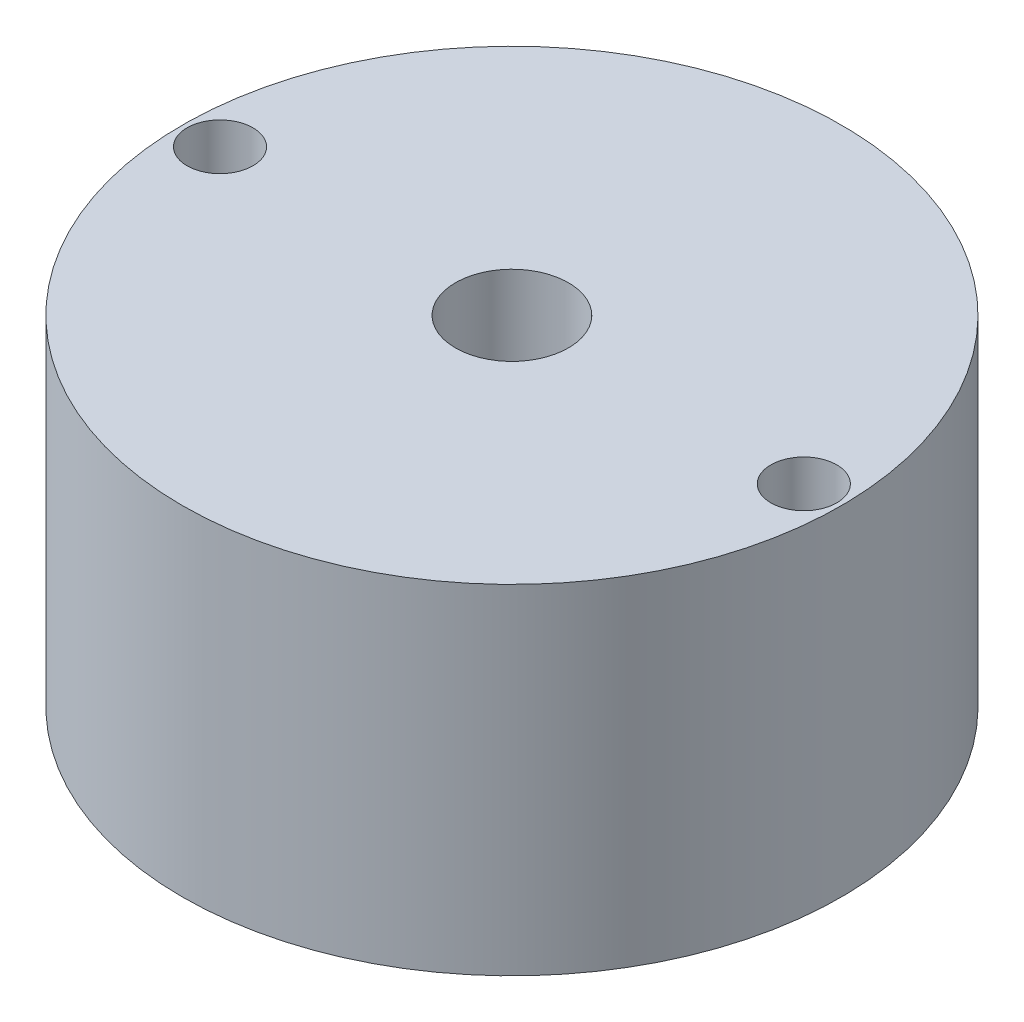
ISO-10303-21;
HEADER;
FILE_DESCRIPTION(('STEP AP214'),'2;1');
FILE_NAME('part.step','',(''),(''),'','','');
FILE_SCHEMA(('AUTOMOTIVE_DESIGN { 1 0 10303 214 1 1 1 1 }'));
ENDSEC;
DATA;
#1=APPLICATION_CONTEXT('core data for automotive mechanical design processes');
#2=APPLICATION_PROTOCOL_DEFINITION('international standard','automotive_design',2000,#1);
#3=PRODUCT_CONTEXT('',#1,'mechanical');
#4=PRODUCT('Part','Part','',(#3));
#5=PRODUCT_RELATED_PRODUCT_CATEGORY('part','',(#4));
#6=PRODUCT_DEFINITION_FORMATION('','',#4);
#7=PRODUCT_DEFINITION_CONTEXT('part definition',#1,'design');
#8=PRODUCT_DEFINITION('design','',#6,#7);
#9=PRODUCT_DEFINITION_SHAPE('','',#8);
#10=(LENGTH_UNIT() NAMED_UNIT(*) SI_UNIT(.MILLI.,.METRE.));
#11=(NAMED_UNIT(*) PLANE_ANGLE_UNIT() SI_UNIT($,.RADIAN.));
#12=(NAMED_UNIT(*) SI_UNIT($,.STERADIAN.) SOLID_ANGLE_UNIT());
#13=UNCERTAINTY_MEASURE_WITH_UNIT(LENGTH_MEASURE(1.E-05),#10,'distance_accuracy_value','');
#14=(GEOMETRIC_REPRESENTATION_CONTEXT(3) GLOBAL_UNCERTAINTY_ASSIGNED_CONTEXT((#13)) GLOBAL_UNIT_ASSIGNED_CONTEXT((#10,
#11,#12)) REPRESENTATION_CONTEXT('',''));
#15=CARTESIAN_POINT('',(0.,0.,0.));
#16=DIRECTION('',(0.,0.,1.));
#17=DIRECTION('',(1.,0.,0.));
#18=AXIS2_PLACEMENT_3D('',#15,#16,#17);
#19=CARTESIAN_POINT('',(0.,18.,0.));
#20=DIRECTION('',(0.,-1.,0.));
#21=DIRECTION('',(0.,0.,-1.));
#22=AXIS2_PLACEMENT_3D('',#19,#20,#21);
#23=CYLINDRICAL_SURFACE('',#22,17.5);
#24=CARTESIAN_POINT('',(0.,18.,0.));
#25=DIRECTION('',(0.,1.,0.));
#26=DIRECTION('',(0.,0.,1.));
#27=AXIS2_PLACEMENT_3D('',#24,#25,#26);
#28=CIRCLE('',#27,17.5);
#29=CARTESIAN_POINT('',(0.,18.,17.5));
#30=VERTEX_POINT('',#29);
#31=EDGE_CURVE('E10',#30,#30,#28,.T.);
#32=ORIENTED_EDGE('',*,*,#31,.F.);
#33=EDGE_LOOP('',(#32));
#34=FACE_BOUND('',#33,.T.);
#35=CARTESIAN_POINT('',(0.,0.,0.));
#36=DIRECTION('',(0.,1.,0.));
#37=DIRECTION('',(0.,0.,1.));
#38=AXIS2_PLACEMENT_3D('',#35,#36,#37);
#39=CIRCLE('',#38,17.5);
#40=CARTESIAN_POINT('',(0.,0.,17.5));
#41=VERTEX_POINT('',#40);
#42=EDGE_CURVE('E46',#41,#41,#39,.T.);
#43=ORIENTED_EDGE('',*,*,#42,.T.);
#44=EDGE_LOOP('',(#43));
#45=FACE_BOUND('',#44,.T.);
#46=ADVANCED_FACE('F43',(#34,#45),#23,.T.);
#47=CARTESIAN_POINT('',(0.,18.,0.));
#48=DIRECTION('',(0.,1.,0.));
#49=DIRECTION('',(0.,0.,1.));
#50=AXIS2_PLACEMENT_3D('',#47,#48,#49);
#51=PLANE('',#50);
#52=CARTESIAN_POINT('',(15.5,18.,0.));
#53=DIRECTION('',(0.,1.,0.));
#54=DIRECTION('',(0.,0.,1.));
#55=AXIS2_PLACEMENT_3D('',#52,#53,#54);
#56=CIRCLE('',#55,1.75);
#57=CARTESIAN_POINT('',(15.5,18.,1.75));
#58=VERTEX_POINT('',#57);
#59=EDGE_CURVE('E73',#58,#58,#56,.T.);
#60=ORIENTED_EDGE('',*,*,#59,.F.);
#61=EDGE_LOOP('',(#60));
#62=FACE_BOUND('',#61,.T.);
#63=CARTESIAN_POINT('',(-15.5,18.,0.));
#64=DIRECTION('',(0.,1.,0.));
#65=DIRECTION('',(0.,0.,1.));
#66=AXIS2_PLACEMENT_3D('',#63,#64,#65);
#67=CIRCLE('',#66,1.75);
#68=CARTESIAN_POINT('',(-15.5,18.,1.75));
#69=VERTEX_POINT('',#68);
#70=EDGE_CURVE('E69',#69,#69,#67,.T.);
#71=ORIENTED_EDGE('',*,*,#70,.F.);
#72=EDGE_LOOP('',(#71));
#73=FACE_BOUND('',#72,.T.);
#74=CARTESIAN_POINT('',(0.,18.,0.));
#75=DIRECTION('',(0.,1.,0.));
#76=DIRECTION('',(0.,0.,1.));
#77=AXIS2_PLACEMENT_3D('',#74,#75,#76);
#78=CIRCLE('',#77,3.);
#79=CARTESIAN_POINT('',(0.,18.,3.));
#80=VERTEX_POINT('',#79);
#81=EDGE_CURVE('E57',#80,#80,#78,.T.);
#82=ORIENTED_EDGE('',*,*,#81,.F.);
#83=EDGE_LOOP('',(#82));
#84=FACE_BOUND('',#83,.T.);
#85=ORIENTED_EDGE('',*,*,#31,.T.);
#86=EDGE_LOOP('',(#85));
#87=FACE_BOUND('',#86,.T.);
#88=ADVANCED_FACE('F90',(#62,#73,#84,#87),#51,.T.);
#89=CARTESIAN_POINT('',(0.,0.,0.));
#90=DIRECTION('',(0.,1.,0.));
#91=DIRECTION('',(0.,0.,1.));
#92=AXIS2_PLACEMENT_3D('',#89,#90,#91);
#93=PLANE('',#92);
#94=ORIENTED_EDGE('',*,*,#42,.F.);
#95=EDGE_LOOP('',(#94));
#96=FACE_BOUND('',#95,.T.);
#97=ADVANCED_FACE('F93',(#96),#93,.F.);
#98=CARTESIAN_POINT('',(0.,6.00000000000001,0.));
#99=DIRECTION('',(0.,1.,0.));
#100=DIRECTION('',(0.,0.,1.));
#101=AXIS2_PLACEMENT_3D('',#98,#99,#100);
#102=CYLINDRICAL_SURFACE('',#101,3.);
#103=CARTESIAN_POINT('',(0.,6.00000000000001,0.));
#104=DIRECTION('',(0.,1.,0.));
#105=DIRECTION('',(0.,0.,1.));
#106=AXIS2_PLACEMENT_3D('',#103,#104,#105);
#107=CIRCLE('',#106,3.);
#108=CARTESIAN_POINT('',(0.,6.00000000000001,3.));
#109=VERTEX_POINT('',#108);
#110=EDGE_CURVE('E55',#109,#109,#107,.T.);
#111=ORIENTED_EDGE('',*,*,#110,.F.);
#112=EDGE_LOOP('',(#111));
#113=FACE_BOUND('',#112,.T.);
#114=ORIENTED_EDGE('',*,*,#81,.T.);
#115=EDGE_LOOP('',(#114));
#116=FACE_BOUND('',#115,.T.);
#117=ADVANCED_FACE('F99',(#113,#116),#102,.F.);
#118=CARTESIAN_POINT('',(0.,6.00000000000001,0.));
#119=DIRECTION('',(0.,1.,0.));
#120=DIRECTION('',(0.,0.,1.));
#121=AXIS2_PLACEMENT_3D('',#118,#119,#120);
#122=PLANE('',#121);
#123=ORIENTED_EDGE('',*,*,#110,.T.);
#124=EDGE_LOOP('',(#123));
#125=FACE_BOUND('',#124,.T.);
#126=ADVANCED_FACE('F101',(#125),#122,.T.);
#127=CARTESIAN_POINT('',(-15.5,10.,0.));
#128=DIRECTION('',(0.,1.,0.));
#129=DIRECTION('',(0.,0.,1.));
#130=AXIS2_PLACEMENT_3D('',#127,#128,#129);
#131=CYLINDRICAL_SURFACE('',#130,1.75);
#132=CARTESIAN_POINT('',(-15.5,10.,0.));
#133=DIRECTION('',(0.,1.,0.));
#134=DIRECTION('',(0.,0.,1.));
#135=AXIS2_PLACEMENT_3D('',#132,#133,#134);
#136=CIRCLE('',#135,1.75);
#137=CARTESIAN_POINT('',(-15.5,10.,1.75));
#138=VERTEX_POINT('',#137);
#139=EDGE_CURVE('E65',#138,#138,#136,.T.);
#140=ORIENTED_EDGE('',*,*,#139,.F.);
#141=EDGE_LOOP('',(#140));
#142=FACE_BOUND('',#141,.T.);
#143=ORIENTED_EDGE('',*,*,#70,.T.);
#144=EDGE_LOOP('',(#143));
#145=FACE_BOUND('',#144,.T.);
#146=ADVANCED_FACE('F108',(#142,#145),#131,.F.);
#147=CARTESIAN_POINT('',(-15.5,10.,0.));
#148=DIRECTION('',(0.,1.,0.));
#149=DIRECTION('',(0.,0.,1.));
#150=AXIS2_PLACEMENT_3D('',#147,#148,#149);
#151=PLANE('',#150);
#152=ORIENTED_EDGE('',*,*,#139,.T.);
#153=EDGE_LOOP('',(#152));
#154=FACE_BOUND('',#153,.T.);
#155=ADVANCED_FACE('F86',(#154),#151,.T.);
#156=CARTESIAN_POINT('',(15.5,10.,0.));
#157=DIRECTION('',(0.,1.,0.));
#158=DIRECTION('',(0.,0.,1.));
#159=AXIS2_PLACEMENT_3D('',#156,#157,#158);
#160=CYLINDRICAL_SURFACE('',#159,1.75);
#161=CARTESIAN_POINT('',(15.5,10.,0.));
#162=DIRECTION('',(0.,1.,0.));
#163=DIRECTION('',(0.,0.,1.));
#164=AXIS2_PLACEMENT_3D('',#161,#162,#163);
#165=CIRCLE('',#164,1.75);
#166=CARTESIAN_POINT('',(15.5,10.,1.75));
#167=VERTEX_POINT('',#166);
#168=EDGE_CURVE('E61',#167,#167,#165,.T.);
#169=ORIENTED_EDGE('',*,*,#168,.F.);
#170=EDGE_LOOP('',(#169));
#171=FACE_BOUND('',#170,.T.);
#172=ORIENTED_EDGE('',*,*,#59,.T.);
#173=EDGE_LOOP('',(#172));
#174=FACE_BOUND('',#173,.T.);
#175=ADVANCED_FACE('F83',(#171,#174),#160,.F.);
#176=CARTESIAN_POINT('',(15.5,10.,0.));
#177=DIRECTION('',(0.,1.,0.));
#178=DIRECTION('',(0.,0.,1.));
#179=AXIS2_PLACEMENT_3D('',#176,#177,#178);
#180=PLANE('',#179);
#181=ORIENTED_EDGE('',*,*,#168,.T.);
#182=EDGE_LOOP('',(#181));
#183=FACE_BOUND('',#182,.T.);
#184=ADVANCED_FACE('F81',(#183),#180,.T.);
#185=CLOSED_SHELL('',(#46,#88,#97,#117,#126,#146,#155,#175,#184));
#186=MANIFOLD_SOLID_BREP('B2',#185);
#187=ADVANCED_BREP_SHAPE_REPRESENTATION('',(#18,#186),#14);
#188=SHAPE_DEFINITION_REPRESENTATION(#9,#187);
ENDSEC;
END-ISO-10303-21;
